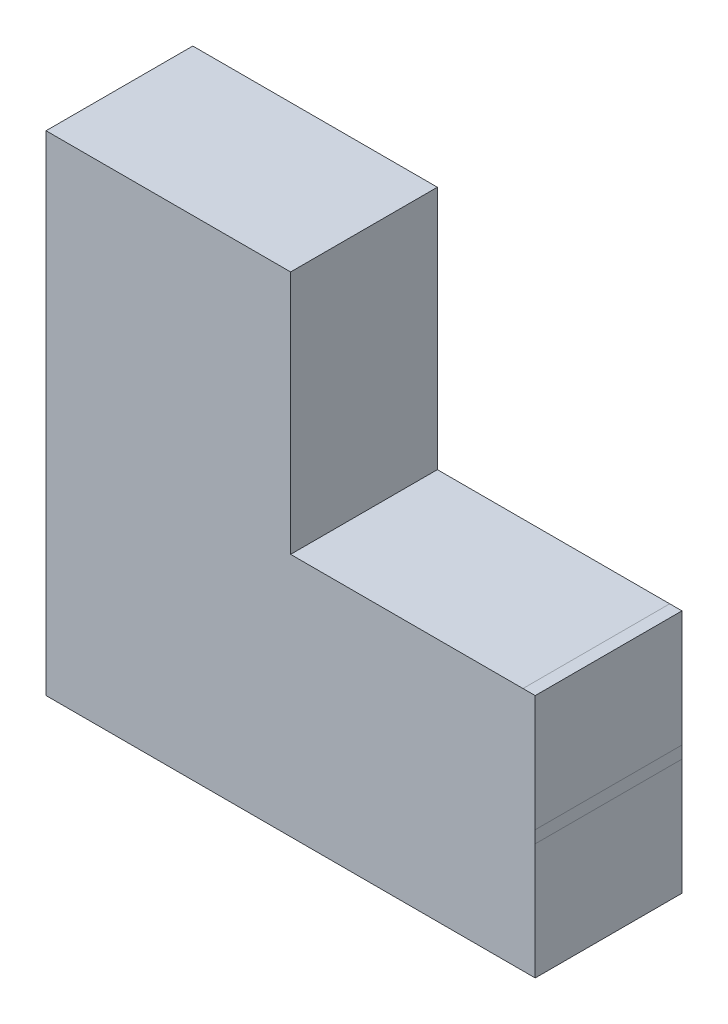
ISO-10303-21;
HEADER;
FILE_DESCRIPTION(('STEP AP214'),'2;1');
FILE_NAME('part.step','',(''),(''),'','','');
FILE_SCHEMA(('AUTOMOTIVE_DESIGN { 1 0 10303 214 1 1 1 1 }'));
ENDSEC;
DATA;
#1=APPLICATION_CONTEXT('core data for automotive mechanical design processes');
#2=APPLICATION_PROTOCOL_DEFINITION('international standard','automotive_design',2000,#1);
#3=PRODUCT_CONTEXT('',#1,'mechanical');
#4=PRODUCT('Part','Part','',(#3));
#5=PRODUCT_RELATED_PRODUCT_CATEGORY('part','',(#4));
#6=PRODUCT_DEFINITION_FORMATION('','',#4);
#7=PRODUCT_DEFINITION_CONTEXT('part definition',#1,'design');
#8=PRODUCT_DEFINITION('design','',#6,#7);
#9=PRODUCT_DEFINITION_SHAPE('','',#8);
#10=(LENGTH_UNIT() NAMED_UNIT(*) SI_UNIT(.MILLI.,.METRE.));
#11=(NAMED_UNIT(*) PLANE_ANGLE_UNIT() SI_UNIT($,.RADIAN.));
#12=(NAMED_UNIT(*) SI_UNIT($,.STERADIAN.) SOLID_ANGLE_UNIT());
#13=UNCERTAINTY_MEASURE_WITH_UNIT(LENGTH_MEASURE(1.E-05),#10,'distance_accuracy_value','');
#14=(GEOMETRIC_REPRESENTATION_CONTEXT(3) GLOBAL_UNCERTAINTY_ASSIGNED_CONTEXT((#13)) GLOBAL_UNIT_ASSIGNED_CONTEXT((#10,
#11,#12)) REPRESENTATION_CONTEXT('',''));
#15=CARTESIAN_POINT('',(0.,0.,0.));
#16=DIRECTION('',(0.,0.,1.));
#17=DIRECTION('',(1.,0.,0.));
#18=AXIS2_PLACEMENT_3D('',#15,#16,#17);
#19=CARTESIAN_POINT('',(1000.,500.,300.));
#20=DIRECTION('',(0.,-1.,0.));
#21=DIRECTION('',(1.,0.,0.));
#22=AXIS2_PLACEMENT_3D('',#19,#20,#21);
#23=PLANE('',#22);
#24=DIRECTION('',(0.,0.,1.));
#25=VECTOR('',#24,1.);
#26=CARTESIAN_POINT('',(975.,500.,300.));
#27=LINE('',#26,#25);
#28=CARTESIAN_POINT('',(975.,500.,0.));
#29=VERTEX_POINT('',#28);
#30=CARTESIAN_POINT('',(975.,500.,300.));
#31=VERTEX_POINT('',#30);
#32=EDGE_CURVE('E11',#29,#31,#27,.T.);
#33=ORIENTED_EDGE('',*,*,#32,.F.);
#34=DIRECTION('',(-1.,0.,0.));
#35=VECTOR('',#34,1.);
#36=CARTESIAN_POINT('',(1000.,500.,0.));
#37=LINE('',#36,#35);
#38=CARTESIAN_POINT('',(500.,500.,0.));
#39=VERTEX_POINT('',#38);
#40=EDGE_CURVE('E175',#29,#39,#37,.T.);
#41=ORIENTED_EDGE('',*,*,#40,.T.);
#42=DIRECTION('',(0.,0.,-1.));
#43=VECTOR('',#42,1.);
#44=CARTESIAN_POINT('',(500.,500.,300.));
#45=LINE('',#44,#43);
#46=CARTESIAN_POINT('',(500.,500.,300.));
#47=VERTEX_POINT('',#46);
#48=EDGE_CURVE('E208',#47,#39,#45,.T.);
#49=ORIENTED_EDGE('',*,*,#48,.F.);
#50=DIRECTION('',(-1.,0.,0.));
#51=VECTOR('',#50,1.);
#52=CARTESIAN_POINT('',(1000.,500.,300.));
#53=LINE('',#52,#51);
#54=EDGE_CURVE('E199',#31,#47,#53,.T.);
#55=ORIENTED_EDGE('',*,*,#54,.F.);
#56=EDGE_LOOP('',(#33,#41,#49,#55));
#57=FACE_BOUND('',#56,.T.);
#58=ADVANCED_FACE('F47',(#57),#23,.F.);
#59=CARTESIAN_POINT('',(1000.,0.,300.));
#60=DIRECTION('',(-1.,0.,0.));
#61=DIRECTION('',(0.,-1.,0.));
#62=AXIS2_PLACEMENT_3D('',#59,#60,#61);
#63=PLANE('',#62);
#64=DIRECTION('',(0.,0.,-1.));
#65=VECTOR('',#64,1.);
#66=CARTESIAN_POINT('',(1000.,237.5,300.));
#67=LINE('',#66,#65);
#68=CARTESIAN_POINT('',(1000.,237.5,300.));
#69=VERTEX_POINT('',#68);
#70=CARTESIAN_POINT('',(1000.,237.5,0.));
#71=VERTEX_POINT('',#70);
#72=EDGE_CURVE('E56',#69,#71,#67,.T.);
#73=ORIENTED_EDGE('',*,*,#72,.F.);
#74=DIRECTION('',(0.,1.,0.));
#75=VECTOR('',#74,1.);
#76=CARTESIAN_POINT('',(1000.,0.,300.));
#77=LINE('',#76,#75);
#78=CARTESIAN_POINT('',(1000.,0.,300.));
#79=VERTEX_POINT('',#78);
#80=EDGE_CURVE('E200',#79,#69,#77,.T.);
#81=ORIENTED_EDGE('',*,*,#80,.F.);
#82=DIRECTION('',(0.,0.,-1.));
#83=VECTOR('',#82,1.);
#84=CARTESIAN_POINT('',(1000.,0.,300.));
#85=LINE('',#84,#83);
#86=CARTESIAN_POINT('',(1000.,0.,0.));
#87=VERTEX_POINT('',#86);
#88=EDGE_CURVE('E123',#79,#87,#85,.T.);
#89=ORIENTED_EDGE('',*,*,#88,.T.);
#90=DIRECTION('',(0.,1.,0.));
#91=VECTOR('',#90,1.);
#92=CARTESIAN_POINT('',(1000.,0.,0.));
#93=LINE('',#92,#91);
#94=EDGE_CURVE('E168',#87,#71,#93,.T.);
#95=ORIENTED_EDGE('',*,*,#94,.T.);
#96=EDGE_LOOP('',(#73,#81,#89,#95));
#97=FACE_BOUND('',#96,.T.);
#98=ADVANCED_FACE('F173',(#97),#63,.F.);
#99=CARTESIAN_POINT('',(1000.,262.5,300.));
#100=VERTEX_POINT('',#99);
#101=EDGE_CURVE('E161',#69,#100,#77,.T.);
#102=ORIENTED_EDGE('',*,*,#101,.F.);
#103=ORIENTED_EDGE('',*,*,#72,.T.);
#104=CARTESIAN_POINT('',(1000.,262.5,0.));
#105=VERTEX_POINT('',#104);
#106=EDGE_CURVE('E160',#71,#105,#93,.T.);
#107=ORIENTED_EDGE('',*,*,#106,.T.);
#108=DIRECTION('',(0.,0.,-1.));
#109=VECTOR('',#108,1.);
#110=CARTESIAN_POINT('',(1000.,262.5,300.));
#111=LINE('',#110,#109);
#112=EDGE_CURVE('E144',#100,#105,#111,.T.);
#113=ORIENTED_EDGE('',*,*,#112,.F.);
#114=EDGE_LOOP('',(#102,#103,#107,#113));
#115=FACE_BOUND('',#114,.T.);
#116=ADVANCED_FACE('F158',(#115),#63,.F.);
#117=CARTESIAN_POINT('',(0.,1000.,300.));
#118=DIRECTION('',(1.,0.,0.));
#119=DIRECTION('',(0.,1.,0.));
#120=AXIS2_PLACEMENT_3D('',#117,#118,#119);
#121=PLANE('',#120);
#122=DIRECTION('',(0.,-1.,0.));
#123=VECTOR('',#122,1.);
#124=CARTESIAN_POINT('',(0.,1000.,0.));
#125=LINE('',#124,#123);
#126=CARTESIAN_POINT('',(0.,1000.,0.));
#127=VERTEX_POINT('',#126);
#128=CARTESIAN_POINT('',(0.,0.,0.));
#129=VERTEX_POINT('',#128);
#130=EDGE_CURVE('E142',#127,#129,#125,.T.);
#131=ORIENTED_EDGE('',*,*,#130,.T.);
#132=DIRECTION('',(0.,0.,-1.));
#133=VECTOR('',#132,1.);
#134=CARTESIAN_POINT('',(0.,0.,300.));
#135=LINE('',#134,#133);
#136=CARTESIAN_POINT('',(0.,0.,300.));
#137=VERTEX_POINT('',#136);
#138=EDGE_CURVE('E120',#137,#129,#135,.T.);
#139=ORIENTED_EDGE('',*,*,#138,.F.);
#140=DIRECTION('',(0.,-1.,0.));
#141=VECTOR('',#140,1.);
#142=CARTESIAN_POINT('',(0.,1000.,300.));
#143=LINE('',#142,#141);
#144=CARTESIAN_POINT('',(0.,1000.,300.));
#145=VERTEX_POINT('',#144);
#146=EDGE_CURVE('E129',#145,#137,#143,.T.);
#147=ORIENTED_EDGE('',*,*,#146,.F.);
#148=DIRECTION('',(0.,0.,-1.));
#149=VECTOR('',#148,1.);
#150=CARTESIAN_POINT('',(0.,1000.,300.));
#151=LINE('',#150,#149);
#152=EDGE_CURVE('E191',#145,#127,#151,.T.);
#153=ORIENTED_EDGE('',*,*,#152,.T.);
#154=EDGE_LOOP('',(#131,#139,#147,#153));
#155=FACE_BOUND('',#154,.T.);
#156=ADVANCED_FACE('F49',(#155),#121,.F.);
#157=CARTESIAN_POINT('',(0.,0.,300.));
#158=DIRECTION('',(0.,1.,0.));
#159=DIRECTION('',(0.,0.,1.));
#160=AXIS2_PLACEMENT_3D('',#157,#158,#159);
#161=PLANE('',#160);
#162=DIRECTION('',(1.,0.,0.));
#163=VECTOR('',#162,1.);
#164=CARTESIAN_POINT('',(0.,0.,0.));
#165=LINE('',#164,#163);
#166=EDGE_CURVE('E181',#129,#87,#165,.T.);
#167=ORIENTED_EDGE('',*,*,#166,.T.);
#168=ORIENTED_EDGE('',*,*,#88,.F.);
#169=DIRECTION('',(1.,0.,0.));
#170=VECTOR('',#169,1.);
#171=CARTESIAN_POINT('',(0.,0.,300.));
#172=LINE('',#171,#170);
#173=EDGE_CURVE('E116',#137,#79,#172,.T.);
#174=ORIENTED_EDGE('',*,*,#173,.F.);
#175=ORIENTED_EDGE('',*,*,#138,.T.);
#176=EDGE_LOOP('',(#167,#168,#174,#175));
#177=FACE_BOUND('',#176,.T.);
#178=ADVANCED_FACE('F118',(#177),#161,.F.);
#179=CARTESIAN_POINT('',(1000.,500.,300.));
#180=VERTEX_POINT('',#179);
#181=EDGE_CURVE('E128',#100,#180,#77,.T.);
#182=ORIENTED_EDGE('',*,*,#181,.F.);
#183=ORIENTED_EDGE('',*,*,#112,.T.);
#184=CARTESIAN_POINT('',(1000.,500.,0.));
#185=VERTEX_POINT('',#184);
#186=EDGE_CURVE('E170',#105,#185,#93,.T.);
#187=ORIENTED_EDGE('',*,*,#186,.T.);
#188=DIRECTION('',(0.,0.,-1.));
#189=VECTOR('',#188,1.);
#190=CARTESIAN_POINT('',(1000.,500.,300.));
#191=LINE('',#190,#189);
#192=EDGE_CURVE('E150',#180,#185,#191,.T.);
#193=ORIENTED_EDGE('',*,*,#192,.F.);
#194=EDGE_LOOP('',(#182,#183,#187,#193));
#195=FACE_BOUND('',#194,.T.);
#196=ADVANCED_FACE('F206',(#195),#63,.F.);
#197=EDGE_CURVE('E177',#185,#29,#37,.T.);
#198=ORIENTED_EDGE('',*,*,#197,.T.);
#199=ORIENTED_EDGE('',*,*,#32,.T.);
#200=EDGE_CURVE('E195',#180,#31,#53,.T.);
#201=ORIENTED_EDGE('',*,*,#200,.F.);
#202=ORIENTED_EDGE('',*,*,#192,.T.);
#203=EDGE_LOOP('',(#198,#199,#201,#202));
#204=FACE_BOUND('',#203,.T.);
#205=ADVANCED_FACE('F209',(#204),#23,.F.);
#206=CARTESIAN_POINT('',(500.,500.,300.));
#207=DIRECTION('',(-1.,0.,0.));
#208=DIRECTION('',(0.,0.,1.));
#209=AXIS2_PLACEMENT_3D('',#206,#207,#208);
#210=PLANE('',#209);
#211=DIRECTION('',(0.,1.,0.));
#212=VECTOR('',#211,1.);
#213=CARTESIAN_POINT('',(500.,500.,0.));
#214=LINE('',#213,#212);
#215=CARTESIAN_POINT('',(500.,1000.,0.));
#216=VERTEX_POINT('',#215);
#217=EDGE_CURVE('E318',#39,#216,#214,.T.);
#218=ORIENTED_EDGE('',*,*,#217,.T.);
#219=DIRECTION('',(0.,0.,-1.));
#220=VECTOR('',#219,1.);
#221=CARTESIAN_POINT('',(500.,1000.,300.));
#222=LINE('',#221,#220);
#223=CARTESIAN_POINT('',(500.,1000.,300.));
#224=VERTEX_POINT('',#223);
#225=EDGE_CURVE('E315',#224,#216,#222,.T.);
#226=ORIENTED_EDGE('',*,*,#225,.F.);
#227=DIRECTION('',(0.,1.,0.));
#228=VECTOR('',#227,1.);
#229=CARTESIAN_POINT('',(500.,500.,300.));
#230=LINE('',#229,#228);
#231=EDGE_CURVE('E192',#47,#224,#230,.T.);
#232=ORIENTED_EDGE('',*,*,#231,.F.);
#233=ORIENTED_EDGE('',*,*,#48,.T.);
#234=EDGE_LOOP('',(#218,#226,#232,#233));
#235=FACE_BOUND('',#234,.T.);
#236=ADVANCED_FACE('F211',(#235),#210,.F.);
#237=CARTESIAN_POINT('',(500.,1000.,300.));
#238=DIRECTION('',(0.,-1.,0.));
#239=DIRECTION('',(1.,0.,0.));
#240=AXIS2_PLACEMENT_3D('',#237,#238,#239);
#241=PLANE('',#240);
#242=DIRECTION('',(-1.,0.,0.));
#243=VECTOR('',#242,1.);
#244=CARTESIAN_POINT('',(500.,1000.,0.));
#245=LINE('',#244,#243);
#246=EDGE_CURVE('E139',#216,#127,#245,.T.);
#247=ORIENTED_EDGE('',*,*,#246,.T.);
#248=ORIENTED_EDGE('',*,*,#152,.F.);
#249=DIRECTION('',(-1.,0.,0.));
#250=VECTOR('',#249,1.);
#251=CARTESIAN_POINT('',(500.,1000.,300.));
#252=LINE('',#251,#250);
#253=EDGE_CURVE('E134',#224,#145,#252,.T.);
#254=ORIENTED_EDGE('',*,*,#253,.F.);
#255=ORIENTED_EDGE('',*,*,#225,.T.);
#256=EDGE_LOOP('',(#247,#248,#254,#255));
#257=FACE_BOUND('',#256,.T.);
#258=ADVANCED_FACE('F218',(#257),#241,.F.);
#259=CARTESIAN_POINT('',(0.,0.,300.));
#260=DIRECTION('',(0.,0.,1.));
#261=DIRECTION('',(1.,0.,0.));
#262=AXIS2_PLACEMENT_3D('',#259,#260,#261);
#263=PLANE('',#262);
#264=ORIENTED_EDGE('',*,*,#146,.T.);
#265=ORIENTED_EDGE('',*,*,#173,.T.);
#266=ORIENTED_EDGE('',*,*,#80,.T.);
#267=ORIENTED_EDGE('',*,*,#101,.T.);
#268=ORIENTED_EDGE('',*,*,#181,.T.);
#269=ORIENTED_EDGE('',*,*,#200,.T.);
#270=ORIENTED_EDGE('',*,*,#54,.T.);
#271=ORIENTED_EDGE('',*,*,#231,.T.);
#272=ORIENTED_EDGE('',*,*,#253,.T.);
#273=EDGE_LOOP('',(#264,#265,#266,#267,#268,#269,#270,#271,#272));
#274=FACE_BOUND('',#273,.T.);
#275=ADVANCED_FACE('F132',(#274),#263,.T.);
#276=CARTESIAN_POINT('',(0.,0.,0.));
#277=DIRECTION('',(0.,0.,1.));
#278=DIRECTION('',(1.,0.,0.));
#279=AXIS2_PLACEMENT_3D('',#276,#277,#278);
#280=PLANE('',#279);
#281=ORIENTED_EDGE('',*,*,#130,.F.);
#282=ORIENTED_EDGE('',*,*,#246,.F.);
#283=ORIENTED_EDGE('',*,*,#217,.F.);
#284=ORIENTED_EDGE('',*,*,#40,.F.);
#285=ORIENTED_EDGE('',*,*,#197,.F.);
#286=ORIENTED_EDGE('',*,*,#186,.F.);
#287=ORIENTED_EDGE('',*,*,#106,.F.);
#288=ORIENTED_EDGE('',*,*,#94,.F.);
#289=ORIENTED_EDGE('',*,*,#166,.F.);
#290=EDGE_LOOP('',(#281,#282,#283,#284,#285,#286,#287,#288,#289));
#291=FACE_BOUND('',#290,.T.);
#292=ADVANCED_FACE('F167',(#291),#280,.F.);
#293=CLOSED_SHELL('',(#58,#98,#116,#156,#178,#196,#205,#236,#258,#275,#292));
#294=MANIFOLD_SOLID_BREP('B2',#293);
#295=ADVANCED_BREP_SHAPE_REPRESENTATION('',(#18,#294),#14);
#296=SHAPE_DEFINITION_REPRESENTATION(#9,#295);
ENDSEC;
END-ISO-10303-21;
